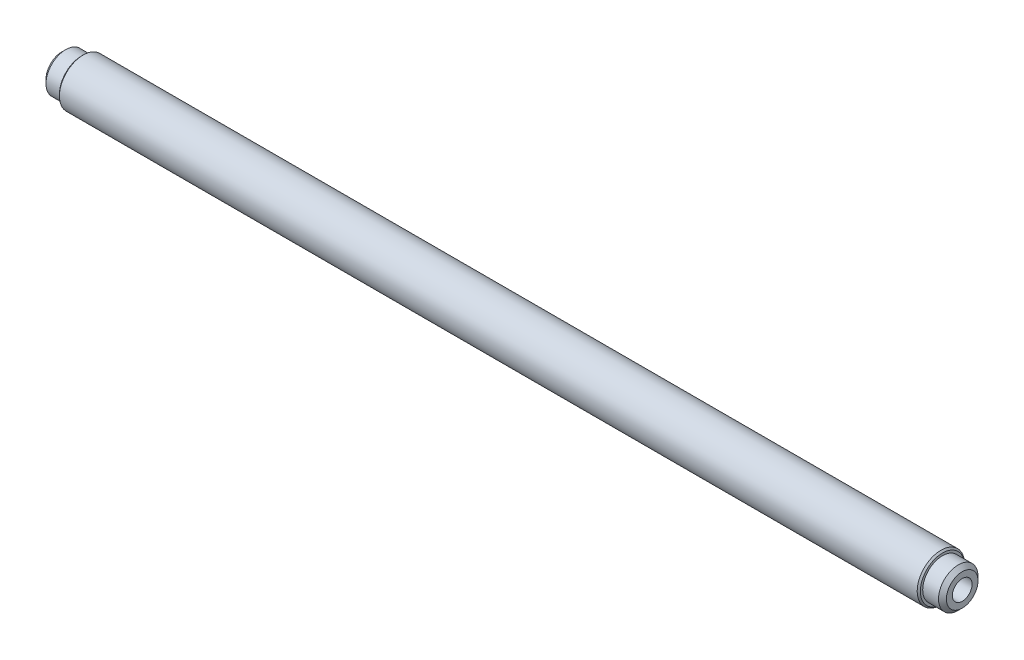
ISO-10303-21;
HEADER;
FILE_DESCRIPTION(('STEP AP214'),'2;1');
FILE_NAME('part.step','',(''),(''),'','','');
FILE_SCHEMA(('AUTOMOTIVE_DESIGN { 1 0 10303 214 1 1 1 1 }'));
ENDSEC;
DATA;
#1=APPLICATION_CONTEXT('core data for automotive mechanical design processes');
#2=APPLICATION_PROTOCOL_DEFINITION('international standard','automotive_design',2000,#1);
#3=PRODUCT_CONTEXT('',#1,'mechanical');
#4=PRODUCT('Part','Part','',(#3));
#5=PRODUCT_RELATED_PRODUCT_CATEGORY('part','',(#4));
#6=PRODUCT_DEFINITION_FORMATION('','',#4);
#7=PRODUCT_DEFINITION_CONTEXT('part definition',#1,'design');
#8=PRODUCT_DEFINITION('design','',#6,#7);
#9=PRODUCT_DEFINITION_SHAPE('','',#8);
#10=(LENGTH_UNIT() NAMED_UNIT(*) SI_UNIT(.MILLI.,.METRE.));
#11=(NAMED_UNIT(*) PLANE_ANGLE_UNIT() SI_UNIT($,.RADIAN.));
#12=(NAMED_UNIT(*) SI_UNIT($,.STERADIAN.) SOLID_ANGLE_UNIT());
#13=UNCERTAINTY_MEASURE_WITH_UNIT(LENGTH_MEASURE(1.E-05),#10,'distance_accuracy_value','');
#14=(GEOMETRIC_REPRESENTATION_CONTEXT(3) GLOBAL_UNCERTAINTY_ASSIGNED_CONTEXT((#13)) GLOBAL_UNIT_ASSIGNED_CONTEXT((#10,
#11,#12)) REPRESENTATION_CONTEXT('',''));
#15=CARTESIAN_POINT('',(0.,0.,0.));
#16=DIRECTION('',(0.,0.,1.));
#17=DIRECTION('',(1.,0.,0.));
#18=AXIS2_PLACEMENT_3D('',#15,#16,#17);
#19=CARTESIAN_POINT('',(114.,2.5,0.));
#20=DIRECTION('',(-1.,0.,0.));
#21=DIRECTION('',(0.,0.,1.));
#22=AXIS2_PLACEMENT_3D('',#19,#20,#21);
#23=PLANE('',#22);
#24=CARTESIAN_POINT('',(114.,0.,0.));
#25=DIRECTION('',(-1.,0.,0.));
#26=DIRECTION('',(0.,0.,1.));
#27=AXIS2_PLACEMENT_3D('',#24,#25,#26);
#28=CIRCLE('',#27,2.00000000000002);
#29=CARTESIAN_POINT('',(114.,0.,2.00000000000002));
#30=VERTEX_POINT('',#29);
#31=EDGE_CURVE('E100',#30,#30,#28,.F.);
#32=ORIENTED_EDGE('',*,*,#31,.T.);
#33=EDGE_LOOP('',(#32));
#34=FACE_BOUND('',#33,.T.);
#35=CARTESIAN_POINT('',(114.,0.,0.));
#36=DIRECTION('',(1.,0.,0.));
#37=DIRECTION('',(0.,0.,-1.));
#38=AXIS2_PLACEMENT_3D('',#35,#36,#37);
#39=CIRCLE('',#38,1.24999999999999);
#40=CARTESIAN_POINT('',(114.,0.,-1.24999999999999));
#41=VERTEX_POINT('',#40);
#42=EDGE_CURVE('E69',#41,#41,#39,.T.);
#43=ORIENTED_EDGE('',*,*,#42,.F.);
#44=EDGE_LOOP('',(#43));
#45=FACE_BOUND('',#44,.T.);
#46=ADVANCED_FACE('F44',(#34,#45),#23,.F.);
#47=CARTESIAN_POINT('',(0.,0.,0.));
#48=DIRECTION('',(-1.,0.,0.));
#49=DIRECTION('',(0.,0.,1.));
#50=AXIS2_PLACEMENT_3D('',#47,#48,#49);
#51=CYLINDRICAL_SURFACE('',#50,2.5);
#52=CARTESIAN_POINT('',(113.5,0.,0.));
#53=DIRECTION('',(-1.,0.,0.));
#54=DIRECTION('',(0.,0.,1.));
#55=AXIS2_PLACEMENT_3D('',#52,#53,#54);
#56=CIRCLE('',#55,2.5);
#57=CARTESIAN_POINT('',(113.5,0.,2.5));
#58=VERTEX_POINT('',#57);
#59=EDGE_CURVE('E97',#58,#58,#56,.T.);
#60=ORIENTED_EDGE('',*,*,#59,.T.);
#61=EDGE_LOOP('',(#60));
#62=FACE_BOUND('',#61,.T.);
#63=CARTESIAN_POINT('',(111.5,0.,0.));
#64=DIRECTION('',(-1.,0.,0.));
#65=DIRECTION('',(0.,0.,1.));
#66=AXIS2_PLACEMENT_3D('',#63,#64,#65);
#67=CIRCLE('',#66,2.5);
#68=CARTESIAN_POINT('',(111.5,0.,2.5));
#69=VERTEX_POINT('',#68);
#70=EDGE_CURVE('E82',#69,#69,#67,.T.);
#71=ORIENTED_EDGE('',*,*,#70,.F.);
#72=EDGE_LOOP('',(#71));
#73=FACE_BOUND('',#72,.T.);
#74=ADVANCED_FACE('F118',(#62,#73),#51,.T.);
#75=CARTESIAN_POINT('',(111.5,2.5,0.));
#76=DIRECTION('',(-1.,0.,0.));
#77=DIRECTION('',(0.,0.,1.));
#78=AXIS2_PLACEMENT_3D('',#75,#76,#77);
#79=PLANE('',#78);
#80=CARTESIAN_POINT('',(111.5,0.,0.));
#81=DIRECTION('',(-1.,0.,0.));
#82=DIRECTION('',(0.,0.,1.));
#83=AXIS2_PLACEMENT_3D('',#80,#81,#82);
#84=CIRCLE('',#83,2.80000000000004);
#85=CARTESIAN_POINT('',(111.5,0.,2.80000000000004));
#86=VERTEX_POINT('',#85);
#87=EDGE_CURVE('E88',#86,#86,#84,.F.);
#88=ORIENTED_EDGE('',*,*,#87,.T.);
#89=EDGE_LOOP('',(#88));
#90=FACE_BOUND('',#89,.T.);
#91=ORIENTED_EDGE('',*,*,#70,.T.);
#92=EDGE_LOOP('',(#91));
#93=FACE_BOUND('',#92,.T.);
#94=ADVANCED_FACE('F124',(#90,#93),#79,.F.);
#95=CARTESIAN_POINT('',(0.,0.,0.));
#96=DIRECTION('',(-1.,0.,0.));
#97=DIRECTION('',(0.,0.,1.));
#98=AXIS2_PLACEMENT_3D('',#95,#96,#97);
#99=CYLINDRICAL_SURFACE('',#98,3.);
#100=CARTESIAN_POINT('',(2.70000000000002,0.,0.));
#101=DIRECTION('',(1.,0.,0.));
#102=DIRECTION('',(0.,0.,-1.));
#103=AXIS2_PLACEMENT_3D('',#100,#101,#102);
#104=CIRCLE('',#103,3.);
#105=CARTESIAN_POINT('',(2.70000000000002,0.,-3.));
#106=VERTEX_POINT('',#105);
#107=EDGE_CURVE('E94',#106,#106,#104,.T.);
#108=ORIENTED_EDGE('',*,*,#107,.T.);
#109=EDGE_LOOP('',(#108));
#110=FACE_BOUND('',#109,.T.);
#111=CARTESIAN_POINT('',(111.3,0.,0.));
#112=DIRECTION('',(-1.,0.,0.));
#113=DIRECTION('',(0.,0.,1.));
#114=AXIS2_PLACEMENT_3D('',#111,#112,#113);
#115=CIRCLE('',#114,3.);
#116=CARTESIAN_POINT('',(111.3,0.,3.));
#117=VERTEX_POINT('',#116);
#118=EDGE_CURVE('E85',#117,#117,#115,.T.);
#119=ORIENTED_EDGE('',*,*,#118,.T.);
#120=EDGE_LOOP('',(#119));
#121=FACE_BOUND('',#120,.T.);
#122=ADVANCED_FACE('F146',(#110,#121),#99,.T.);
#123=CARTESIAN_POINT('',(2.5,2.99999999999999,0.));
#124=DIRECTION('',(1.,0.,0.));
#125=DIRECTION('',(0.,0.,-1.));
#126=AXIS2_PLACEMENT_3D('',#123,#124,#125);
#127=PLANE('',#126);
#128=CARTESIAN_POINT('',(2.5,0.,0.));
#129=DIRECTION('',(1.,0.,0.));
#130=DIRECTION('',(0.,0.,-1.));
#131=AXIS2_PLACEMENT_3D('',#128,#129,#130);
#132=CIRCLE('',#131,2.79999999999998);
#133=CARTESIAN_POINT('',(2.5,0.,-2.79999999999998));
#134=VERTEX_POINT('',#133);
#135=EDGE_CURVE('E91',#134,#134,#132,.F.);
#136=ORIENTED_EDGE('',*,*,#135,.T.);
#137=EDGE_LOOP('',(#136));
#138=FACE_BOUND('',#137,.T.);
#139=CARTESIAN_POINT('',(2.5,0.,0.));
#140=DIRECTION('',(-1.,0.,0.));
#141=DIRECTION('',(0.,0.,1.));
#142=AXIS2_PLACEMENT_3D('',#139,#140,#141);
#143=CIRCLE('',#142,2.5);
#144=CARTESIAN_POINT('',(2.5,0.,2.5));
#145=VERTEX_POINT('',#144);
#146=EDGE_CURVE('E79',#145,#145,#143,.T.);
#147=ORIENTED_EDGE('',*,*,#146,.F.);
#148=EDGE_LOOP('',(#147));
#149=FACE_BOUND('',#148,.T.);
#150=ADVANCED_FACE('F142',(#138,#149),#127,.F.);
#151=CARTESIAN_POINT('',(0.,0.,0.));
#152=DIRECTION('',(-1.,0.,0.));
#153=DIRECTION('',(0.,0.,1.));
#154=AXIS2_PLACEMENT_3D('',#151,#152,#153);
#155=CYLINDRICAL_SURFACE('',#154,2.5);
#156=CARTESIAN_POINT('',(0.500000000000005,0.,0.));
#157=DIRECTION('',(1.,0.,0.));
#158=DIRECTION('',(0.,0.,-1.));
#159=AXIS2_PLACEMENT_3D('',#156,#157,#158);
#160=CIRCLE('',#159,2.5);
#161=CARTESIAN_POINT('',(0.500000000000005,0.,-2.5));
#162=VERTEX_POINT('',#161);
#163=EDGE_CURVE('E11',#162,#162,#160,.T.);
#164=ORIENTED_EDGE('',*,*,#163,.T.);
#165=EDGE_LOOP('',(#164));
#166=FACE_BOUND('',#165,.T.);
#167=ORIENTED_EDGE('',*,*,#146,.T.);
#168=EDGE_LOOP('',(#167));
#169=FACE_BOUND('',#168,.T.);
#170=ADVANCED_FACE('F145',(#166,#169),#155,.T.);
#171=CARTESIAN_POINT('',(0.,2.5,0.));
#172=DIRECTION('',(1.,0.,0.));
#173=DIRECTION('',(0.,0.,-1.));
#174=AXIS2_PLACEMENT_3D('',#171,#172,#173);
#175=PLANE('',#174);
#176=CARTESIAN_POINT('',(0.,0.,0.));
#177=DIRECTION('',(1.,0.,0.));
#178=DIRECTION('',(0.,0.,-1.));
#179=AXIS2_PLACEMENT_3D('',#176,#177,#178);
#180=CIRCLE('',#179,1.99999999999999);
#181=CARTESIAN_POINT('',(0.,0.,-1.99999999999999));
#182=VERTEX_POINT('',#181);
#183=EDGE_CURVE('E52',#182,#182,#180,.F.);
#184=ORIENTED_EDGE('',*,*,#183,.T.);
#185=EDGE_LOOP('',(#184));
#186=FACE_BOUND('',#185,.T.);
#187=CARTESIAN_POINT('',(0.,0.,0.));
#188=DIRECTION('',(-1.,0.,0.));
#189=DIRECTION('',(0.,0.,1.));
#190=AXIS2_PLACEMENT_3D('',#187,#188,#189);
#191=CIRCLE('',#190,1.24999999999999);
#192=CARTESIAN_POINT('',(0.,0.,1.24999999999999));
#193=VERTEX_POINT('',#192);
#194=EDGE_CURVE('E68',#193,#193,#191,.T.);
#195=ORIENTED_EDGE('',*,*,#194,.F.);
#196=EDGE_LOOP('',(#195));
#197=FACE_BOUND('',#196,.T.);
#198=ADVANCED_FACE('F105',(#186,#197),#175,.F.);
#199=CARTESIAN_POINT('',(8.50000000000001,0.,0.));
#200=DIRECTION('',(-1.,0.,0.));
#201=DIRECTION('',(0.,0.,1.));
#202=AXIS2_PLACEMENT_3D('',#199,#200,#201);
#203=CONICAL_SURFACE('',#202,1.24999999999999,1.02974425867665);
#204=CARTESIAN_POINT('',(9.25107577378445,0.,0.));
#205=VERTEX_POINT('',#204);
#206=VERTEX_LOOP('',#205);
#207=FACE_BOUND('',#206,.T.);
#208=CARTESIAN_POINT('',(8.50000000000001,0.,0.));
#209=DIRECTION('',(-1.,0.,0.));
#210=DIRECTION('',(0.,0.,1.));
#211=AXIS2_PLACEMENT_3D('',#208,#209,#210);
#212=CIRCLE('',#211,1.24999999999999);
#213=CARTESIAN_POINT('',(8.50000000000001,0.,1.24999999999999));
#214=VERTEX_POINT('',#213);
#215=EDGE_CURVE('E72',#214,#214,#212,.T.);
#216=ORIENTED_EDGE('',*,*,#215,.T.);
#217=EDGE_LOOP('',(#216));
#218=FACE_BOUND('',#217,.T.);
#219=ADVANCED_FACE('F156',(#207,#218),#203,.F.);
#220=CARTESIAN_POINT('',(0.,0.,0.));
#221=DIRECTION('',(-1.,0.,0.));
#222=DIRECTION('',(0.,0.,1.));
#223=AXIS2_PLACEMENT_3D('',#220,#221,#222);
#224=CYLINDRICAL_SURFACE('',#223,1.24999999999999);
#225=ORIENTED_EDGE('',*,*,#215,.F.);
#226=EDGE_LOOP('',(#225));
#227=FACE_BOUND('',#226,.T.);
#228=ORIENTED_EDGE('',*,*,#194,.T.);
#229=EDGE_LOOP('',(#228));
#230=FACE_BOUND('',#229,.T.);
#231=ADVANCED_FACE('F62',(#227,#230),#224,.F.);
#232=CARTESIAN_POINT('',(105.5,0.,0.));
#233=DIRECTION('',(1.,0.,0.));
#234=DIRECTION('',(0.,0.,-1.));
#235=AXIS2_PLACEMENT_3D('',#232,#233,#234);
#236=CONICAL_SURFACE('',#235,1.24999999999999,1.02974425867665);
#237=CARTESIAN_POINT('',(104.748924226216,0.,0.));
#238=VERTEX_POINT('',#237);
#239=VERTEX_LOOP('',#238);
#240=FACE_BOUND('',#239,.T.);
#241=CARTESIAN_POINT('',(105.5,0.,0.));
#242=DIRECTION('',(1.,0.,0.));
#243=DIRECTION('',(0.,0.,-1.));
#244=AXIS2_PLACEMENT_3D('',#241,#242,#243);
#245=CIRCLE('',#244,1.24999999999999);
#246=CARTESIAN_POINT('',(105.5,0.,-1.24999999999999));
#247=VERTEX_POINT('',#246);
#248=EDGE_CURVE('E66',#247,#247,#245,.T.);
#249=ORIENTED_EDGE('',*,*,#248,.T.);
#250=EDGE_LOOP('',(#249));
#251=FACE_BOUND('',#250,.T.);
#252=ADVANCED_FACE('F58',(#240,#251),#236,.F.);
#253=CARTESIAN_POINT('',(114.,0.,0.));
#254=DIRECTION('',(1.,0.,0.));
#255=DIRECTION('',(0.,0.,-1.));
#256=AXIS2_PLACEMENT_3D('',#253,#254,#255);
#257=CYLINDRICAL_SURFACE('',#256,1.24999999999999);
#258=ORIENTED_EDGE('',*,*,#248,.F.);
#259=EDGE_LOOP('',(#258));
#260=FACE_BOUND('',#259,.T.);
#261=ORIENTED_EDGE('',*,*,#42,.T.);
#262=EDGE_LOOP('',(#261));
#263=FACE_BOUND('',#262,.T.);
#264=ADVANCED_FACE('F61',(#260,#263),#257,.F.);
#265=CARTESIAN_POINT('',(111.3,0.,0.));
#266=DIRECTION('',(-1.,0.,0.));
#267=DIRECTION('',(0.,0.,1.));
#268=AXIS2_PLACEMENT_3D('',#265,#266,#267);
#269=CONICAL_SURFACE('',#268,3.,0.78539816339744);
#270=ORIENTED_EDGE('',*,*,#87,.F.);
#271=EDGE_LOOP('',(#270));
#272=FACE_BOUND('',#271,.T.);
#273=ORIENTED_EDGE('',*,*,#118,.F.);
#274=EDGE_LOOP('',(#273));
#275=FACE_BOUND('',#274,.T.);
#276=ADVANCED_FACE('F130',(#272,#275),#269,.T.);
#277=CARTESIAN_POINT('',(2.5,0.,0.));
#278=DIRECTION('',(1.,0.,0.));
#279=DIRECTION('',(0.,0.,-1.));
#280=AXIS2_PLACEMENT_3D('',#277,#278,#279);
#281=CONICAL_SURFACE('',#280,2.79999999999998,0.785398163397443);
#282=ORIENTED_EDGE('',*,*,#107,.F.);
#283=EDGE_LOOP('',(#282));
#284=FACE_BOUND('',#283,.T.);
#285=ORIENTED_EDGE('',*,*,#135,.F.);
#286=EDGE_LOOP('',(#285));
#287=FACE_BOUND('',#286,.T.);
#288=ADVANCED_FACE('F114',(#284,#287),#281,.T.);
#289=CARTESIAN_POINT('',(113.5,0.,0.));
#290=DIRECTION('',(-1.,0.,0.));
#291=DIRECTION('',(0.,0.,1.));
#292=AXIS2_PLACEMENT_3D('',#289,#290,#291);
#293=CONICAL_SURFACE('',#292,2.5,0.78539816339746);
#294=ORIENTED_EDGE('',*,*,#31,.F.);
#295=EDGE_LOOP('',(#294));
#296=FACE_BOUND('',#295,.T.);
#297=ORIENTED_EDGE('',*,*,#59,.F.);
#298=EDGE_LOOP('',(#297));
#299=FACE_BOUND('',#298,.T.);
#300=ADVANCED_FACE('F109',(#296,#299),#293,.T.);
#301=CARTESIAN_POINT('',(0.,0.,0.));
#302=DIRECTION('',(1.,0.,0.));
#303=DIRECTION('',(0.,0.,-1.));
#304=AXIS2_PLACEMENT_3D('',#301,#302,#303);
#305=CONICAL_SURFACE('',#304,1.99999999999999,0.785398163397453);
#306=ORIENTED_EDGE('',*,*,#163,.F.);
#307=EDGE_LOOP('',(#306));
#308=FACE_BOUND('',#307,.T.);
#309=ORIENTED_EDGE('',*,*,#183,.F.);
#310=EDGE_LOOP('',(#309));
#311=FACE_BOUND('',#310,.T.);
#312=ADVANCED_FACE('F46',(#308,#311),#305,.T.);
#313=CLOSED_SHELL('',(#46,#74,#94,#122,#150,#170,#198,#219,#231,#252,#264,#276,#288,#300,#312));
#314=MANIFOLD_SOLID_BREP('B2',#313);
#315=ADVANCED_BREP_SHAPE_REPRESENTATION('',(#18,#314),#14);
#316=SHAPE_DEFINITION_REPRESENTATION(#9,#315);
ENDSEC;
END-ISO-10303-21;
